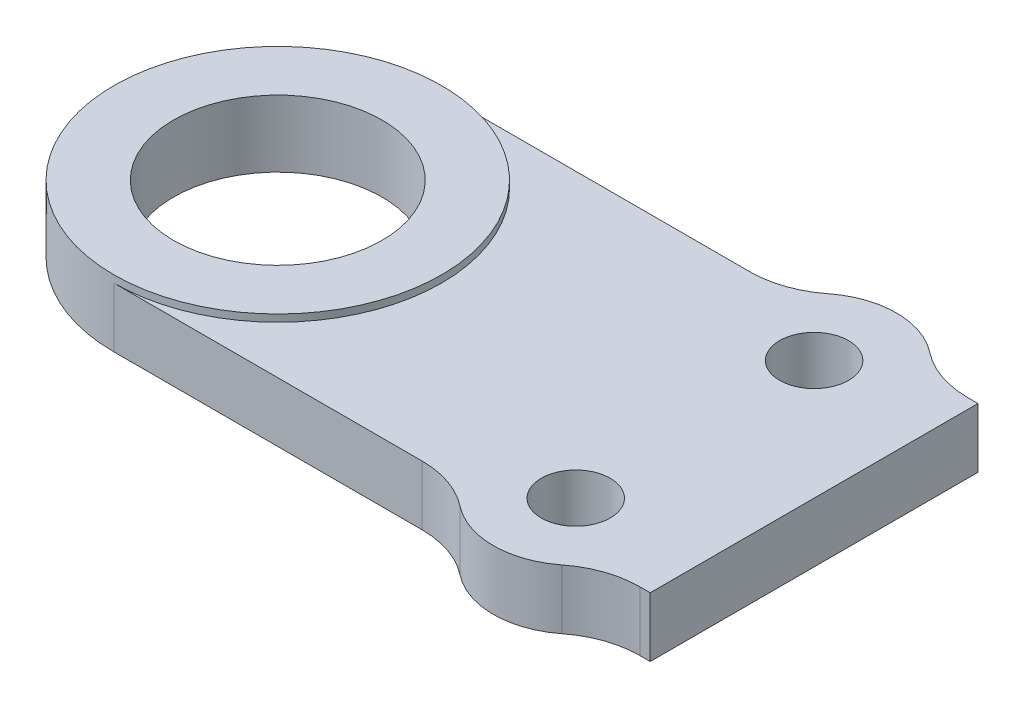
ISO-10303-21;
HEADER;
FILE_DESCRIPTION(('STEP AP214'),'2;1');
FILE_NAME('part.step','',(''),(''),'','','');
FILE_SCHEMA(('AUTOMOTIVE_DESIGN { 1 0 10303 214 1 1 1 1 }'));
ENDSEC;
DATA;
#1=APPLICATION_CONTEXT('core data for automotive mechanical design processes');
#2=APPLICATION_PROTOCOL_DEFINITION('international standard','automotive_design',2000,#1);
#3=PRODUCT_CONTEXT('',#1,'mechanical');
#4=PRODUCT('Part','Part','',(#3));
#5=PRODUCT_RELATED_PRODUCT_CATEGORY('part','',(#4));
#6=PRODUCT_DEFINITION_FORMATION('','',#4);
#7=PRODUCT_DEFINITION_CONTEXT('part definition',#1,'design');
#8=PRODUCT_DEFINITION('design','',#6,#7);
#9=PRODUCT_DEFINITION_SHAPE('','',#8);
#10=(LENGTH_UNIT() NAMED_UNIT(*) SI_UNIT(.MILLI.,.METRE.));
#11=(NAMED_UNIT(*) PLANE_ANGLE_UNIT() SI_UNIT($,.RADIAN.));
#12=(NAMED_UNIT(*) SI_UNIT($,.STERADIAN.) SOLID_ANGLE_UNIT());
#13=UNCERTAINTY_MEASURE_WITH_UNIT(LENGTH_MEASURE(1.E-05),#10,'distance_accuracy_value','');
#14=(GEOMETRIC_REPRESENTATION_CONTEXT(3) GLOBAL_UNCERTAINTY_ASSIGNED_CONTEXT((#13)) GLOBAL_UNIT_ASSIGNED_CONTEXT((#10,
#11,#12)) REPRESENTATION_CONTEXT('',''));
#15=CARTESIAN_POINT('',(0.,0.,0.));
#16=DIRECTION('',(0.,0.,1.));
#17=DIRECTION('',(1.,0.,0.));
#18=AXIS2_PLACEMENT_3D('',#15,#16,#17);
#19=CARTESIAN_POINT('',(0.151037449392715,6.35,-19.1962171052632));
#20=DIRECTION('',(0.,-1.,0.));
#21=DIRECTION('',(0.,0.,-1.));
#22=AXIS2_PLACEMENT_3D('',#19,#20,#21);
#23=PLANE('',#22);
#24=CARTESIAN_POINT('',(0.151037449392716,6.35,-19.1962171052632));
#25=DIRECTION('',(0.,1.,0.));
#26=DIRECTION('',(0.,0.,1.));
#27=AXIS2_PLACEMENT_3D('',#24,#25,#26);
#28=CIRCLE('',#27,3.675);
#29=CARTESIAN_POINT('',(0.151037449392716,6.35,-15.5212171052632));
#30=VERTEX_POINT('',#29);
#31=EDGE_CURVE('E345',#30,#30,#28,.T.);
#32=ORIENTED_EDGE('',*,*,#31,.F.);
#33=EDGE_LOOP('',(#32));
#34=FACE_BOUND('',#33,.T.);
#35=CARTESIAN_POINT('',(0.151037449392719,6.35,6.20378289473684));
#36=DIRECTION('',(0.,1.,0.));
#37=DIRECTION('',(0.,0.,1.));
#38=AXIS2_PLACEMENT_3D('',#35,#36,#37);
#39=CIRCLE('',#38,3.675);
#40=CARTESIAN_POINT('',(0.151037449392719,6.35,9.87878289473684));
#41=VERTEX_POINT('',#40);
#42=EDGE_CURVE('E152',#41,#41,#39,.T.);
#43=ORIENTED_EDGE('',*,*,#42,.F.);
#44=EDGE_LOOP('',(#43));
#45=FACE_BOUND('',#44,.T.);
#46=CARTESIAN_POINT('',(-44.2989625506073,6.35,-6.49621710526316));
#47=DIRECTION('',(0.,1.,0.));
#48=DIRECTION('',(0.,0.,1.));
#49=AXIS2_PLACEMENT_3D('',#46,#47,#48);
#50=CIRCLE('',#49,17.4625);
#51=CARTESIAN_POINT('',(-44.2989625506073,6.35,10.9662828947368));
#52=VERTEX_POINT('',#51);
#53=CARTESIAN_POINT('',(-44.2989625506073,6.35,-23.9587171052632));
#54=VERTEX_POINT('',#53);
#55=EDGE_CURVE('E141',#52,#54,#50,.T.);
#56=ORIENTED_EDGE('',*,*,#55,.F.);
#57=DIRECTION('',(1.,0.,0.));
#58=VECTOR('',#57,1.);
#59=CARTESIAN_POINT('',(-7.22409275692232,6.35,10.9662828947368));
#60=LINE('',#59,#58);
#61=CARTESIAN_POINT('',(-11.4561193511259,6.35,10.9662828947368));
#62=VERTEX_POINT('',#61);
#63=EDGE_CURVE('E123',#52,#62,#60,.T.);
#64=ORIENTED_EDGE('',*,*,#63,.T.);
#65=CARTESIAN_POINT('',(-11.4561193511259,6.35,20.9662828947368));
#66=DIRECTION('',(0.,-1.,0.));
#67=DIRECTION('',(0.,0.,-1.));
#68=AXIS2_PLACEMENT_3D('',#65,#66,#67);
#69=CIRCLE('',#68,10.);
#70=CARTESIAN_POINT('',(-5.27525386673139,6.35,13.1051823443164));
#71=VERTEX_POINT('',#70);
#72=EDGE_CURVE('E213',#62,#71,#69,.T.);
#73=ORIENTED_EDGE('',*,*,#72,.T.);
#74=CARTESIAN_POINT('',(0.151037449392715,6.35,6.20378289473683));
#75=DIRECTION('',(0.,1.,0.));
#76=DIRECTION('',(0.,0.,1.));
#77=AXIS2_PLACEMENT_3D('',#74,#75,#76);
#78=CIRCLE('',#77,8.77917717158621);
#79=CARTESIAN_POINT('',(5.57732876551683,6.35,13.1051823443164));
#80=VERTEX_POINT('',#79);
#81=EDGE_CURVE('E133',#71,#80,#78,.T.);
#82=ORIENTED_EDGE('',*,*,#81,.T.);
#83=CARTESIAN_POINT('',(11.7581942499113,6.35,20.9662828947368));
#84=DIRECTION('',(0.,-1.,0.));
#85=DIRECTION('',(0.,0.,-1.));
#86=AXIS2_PLACEMENT_3D('',#83,#84,#85);
#87=CIRCLE('',#86,10.);
#88=CARTESIAN_POINT('',(11.7581942499113,6.35,10.9662828947368));
#89=VERTEX_POINT('',#88);
#90=EDGE_CURVE('E11',#80,#89,#87,.T.);
#91=ORIENTED_EDGE('',*,*,#90,.T.);
#92=DIRECTION('',(1.,0.,0.));
#93=VECTOR('',#92,1.);
#94=CARTESIAN_POINT('',(7.52616765570776,6.35,10.9662828947368));
#95=LINE('',#94,#93);
#96=CARTESIAN_POINT('',(12.8510374493927,6.35,10.9662828947368));
#97=VERTEX_POINT('',#96);
#98=EDGE_CURVE('E226',#89,#97,#95,.T.);
#99=ORIENTED_EDGE('',*,*,#98,.T.);
#100=DIRECTION('',(0.,0.,-1.));
#101=VECTOR('',#100,1.);
#102=CARTESIAN_POINT('',(12.8510374493927,6.35,-23.9587171052632));
#103=LINE('',#102,#101);
#104=CARTESIAN_POINT('',(12.8510374493927,6.35,-23.9587171052632));
#105=VERTEX_POINT('',#104);
#106=EDGE_CURVE('E232',#97,#105,#103,.T.);
#107=ORIENTED_EDGE('',*,*,#106,.T.);
#108=DIRECTION('',(-1.,0.,0.));
#109=VECTOR('',#108,1.);
#110=CARTESIAN_POINT('',(7.52616765570776,6.35,-23.9587171052632));
#111=LINE('',#110,#109);
#112=CARTESIAN_POINT('',(11.7581942499113,6.35,-23.9587171052632));
#113=VERTEX_POINT('',#112);
#114=EDGE_CURVE('E234',#105,#113,#111,.T.);
#115=ORIENTED_EDGE('',*,*,#114,.T.);
#116=CARTESIAN_POINT('',(11.7581942499113,6.35,-33.9587171052632));
#117=DIRECTION('',(0.,-1.,0.));
#118=DIRECTION('',(0.,0.,-1.));
#119=AXIS2_PLACEMENT_3D('',#116,#117,#118);
#120=CIRCLE('',#119,10.);
#121=CARTESIAN_POINT('',(5.57732876551683,6.35,-26.0976165548427));
#122=VERTEX_POINT('',#121);
#123=EDGE_CURVE('E205',#113,#122,#120,.T.);
#124=ORIENTED_EDGE('',*,*,#123,.T.);
#125=CARTESIAN_POINT('',(0.151037449392715,6.35,-19.1962171052632));
#126=DIRECTION('',(0.,1.,0.));
#127=DIRECTION('',(0.,0.,-1.));
#128=AXIS2_PLACEMENT_3D('',#125,#126,#127);
#129=CIRCLE('',#128,8.77917717158622);
#130=CARTESIAN_POINT('',(-5.2752538667314,6.35,-26.0976165548427));
#131=VERTEX_POINT('',#130);
#132=EDGE_CURVE('E168',#122,#131,#129,.T.);
#133=ORIENTED_EDGE('',*,*,#132,.T.);
#134=CARTESIAN_POINT('',(-11.4561193511259,6.35,-33.9587171052632));
#135=DIRECTION('',(0.,-1.,0.));
#136=DIRECTION('',(0.,0.,-1.));
#137=AXIS2_PLACEMENT_3D('',#134,#135,#136);
#138=CIRCLE('',#137,10.);
#139=CARTESIAN_POINT('',(-11.4561193511259,6.35,-23.9587171052632));
#140=VERTEX_POINT('',#139);
#141=EDGE_CURVE('E209',#131,#140,#138,.T.);
#142=ORIENTED_EDGE('',*,*,#141,.T.);
#143=DIRECTION('',(-1.,0.,0.));
#144=VECTOR('',#143,1.);
#145=CARTESIAN_POINT('',(-44.2989625506073,6.35,-23.9587171052632));
#146=LINE('',#145,#144);
#147=EDGE_CURVE('E134',#140,#54,#146,.T.);
#148=ORIENTED_EDGE('',*,*,#147,.T.);
#149=EDGE_LOOP('',(#56,#64,#73,#82,#91,#99,#107,#115,#124,#133,#142,#148));
#150=FACE_BOUND('',#149,.T.);
#151=ADVANCED_FACE('F33',(#34,#45,#150),#23,.F.);
#152=CARTESIAN_POINT('',(0.151037449392715,0.,-19.1962171052632));
#153=DIRECTION('',(0.,-1.,0.));
#154=DIRECTION('',(0.,0.,-1.));
#155=AXIS2_PLACEMENT_3D('',#152,#153,#154);
#156=PLANE('',#155);
#157=CARTESIAN_POINT('',(0.151037449392719,0.,6.20378289473684));
#158=DIRECTION('',(0.,1.,0.));
#159=DIRECTION('',(0.,0.,1.));
#160=AXIS2_PLACEMENT_3D('',#157,#158,#159);
#161=CIRCLE('',#160,3.675);
#162=CARTESIAN_POINT('',(0.151037449392719,0.,9.87878289473684));
#163=VERTEX_POINT('',#162);
#164=EDGE_CURVE('E158',#163,#163,#161,.T.);
#165=ORIENTED_EDGE('',*,*,#164,.T.);
#166=EDGE_LOOP('',(#165));
#167=FACE_BOUND('',#166,.T.);
#168=CARTESIAN_POINT('',(0.151037449392716,0.,-19.1962171052632));
#169=DIRECTION('',(0.,1.,0.));
#170=DIRECTION('',(0.,0.,1.));
#171=AXIS2_PLACEMENT_3D('',#168,#169,#170);
#172=CIRCLE('',#171,3.675);
#173=CARTESIAN_POINT('',(0.151037449392716,0.,-15.5212171052632));
#174=VERTEX_POINT('',#173);
#175=EDGE_CURVE('E343',#174,#174,#172,.T.);
#176=ORIENTED_EDGE('',*,*,#175,.T.);
#177=EDGE_LOOP('',(#176));
#178=FACE_BOUND('',#177,.T.);
#179=DIRECTION('',(1.,0.,0.));
#180=VECTOR('',#179,1.);
#181=CARTESIAN_POINT('',(7.52616765570776,0.,10.9662828947368));
#182=LINE('',#181,#180);
#183=CARTESIAN_POINT('',(11.7581942499113,0.,10.9662828947368));
#184=VERTEX_POINT('',#183);
#185=CARTESIAN_POINT('',(12.8510374493927,0.,10.9662828947368));
#186=VERTEX_POINT('',#185);
#187=EDGE_CURVE('E221',#184,#186,#182,.T.);
#188=ORIENTED_EDGE('',*,*,#187,.F.);
#189=CARTESIAN_POINT('',(11.7581942499113,0.,20.9662828947368));
#190=DIRECTION('',(0.,-1.,0.));
#191=DIRECTION('',(0.,0.,-1.));
#192=AXIS2_PLACEMENT_3D('',#189,#190,#191);
#193=CIRCLE('',#192,10.);
#194=CARTESIAN_POINT('',(5.57732876551683,0.,13.1051823443164));
#195=VERTEX_POINT('',#194);
#196=EDGE_CURVE('E42',#184,#195,#193,.F.);
#197=ORIENTED_EDGE('',*,*,#196,.T.);
#198=CARTESIAN_POINT('',(0.151037449392715,0.,6.20378289473683));
#199=DIRECTION('',(0.,1.,0.));
#200=DIRECTION('',(0.,0.,1.));
#201=AXIS2_PLACEMENT_3D('',#198,#199,#200);
#202=CIRCLE('',#201,8.77917717158621);
#203=CARTESIAN_POINT('',(-5.27525386673139,0.,13.1051823443164));
#204=VERTEX_POINT('',#203);
#205=EDGE_CURVE('E183',#204,#195,#202,.T.);
#206=ORIENTED_EDGE('',*,*,#205,.F.);
#207=CARTESIAN_POINT('',(-11.4561193511259,0.,20.9662828947368));
#208=DIRECTION('',(0.,-1.,0.));
#209=DIRECTION('',(0.,0.,-1.));
#210=AXIS2_PLACEMENT_3D('',#207,#208,#209);
#211=CIRCLE('',#210,10.);
#212=CARTESIAN_POINT('',(-11.4561193511259,0.,10.9662828947368));
#213=VERTEX_POINT('',#212);
#214=EDGE_CURVE('E211',#204,#213,#211,.F.);
#215=ORIENTED_EDGE('',*,*,#214,.T.);
#216=DIRECTION('',(1.,0.,0.));
#217=VECTOR('',#216,1.);
#218=CARTESIAN_POINT('',(-7.22409275692232,0.,10.9662828947368));
#219=LINE('',#218,#217);
#220=CARTESIAN_POINT('',(-44.2989625506073,0.,10.9662828947368));
#221=VERTEX_POINT('',#220);
#222=EDGE_CURVE('E227',#221,#213,#219,.T.);
#223=ORIENTED_EDGE('',*,*,#222,.F.);
#224=CARTESIAN_POINT('',(-44.2989625506073,0.,-6.49621710526316));
#225=DIRECTION('',(0.,1.,0.));
#226=DIRECTION('',(0.,0.,1.));
#227=AXIS2_PLACEMENT_3D('',#224,#225,#226);
#228=CIRCLE('',#227,17.4625);
#229=CARTESIAN_POINT('',(-44.2989625506073,0.,-23.9587171052632));
#230=VERTEX_POINT('',#229);
#231=EDGE_CURVE('E143',#230,#221,#228,.T.);
#232=ORIENTED_EDGE('',*,*,#231,.F.);
#233=DIRECTION('',(-1.,0.,0.));
#234=VECTOR('',#233,1.);
#235=CARTESIAN_POINT('',(-44.2989625506073,0.,-23.9587171052632));
#236=LINE('',#235,#234);
#237=CARTESIAN_POINT('',(-11.4561193511259,0.,-23.9587171052632));
#238=VERTEX_POINT('',#237);
#239=EDGE_CURVE('E253',#238,#230,#236,.T.);
#240=ORIENTED_EDGE('',*,*,#239,.F.);
#241=CARTESIAN_POINT('',(-11.4561193511259,0.,-33.9587171052632));
#242=DIRECTION('',(0.,-1.,0.));
#243=DIRECTION('',(0.,0.,-1.));
#244=AXIS2_PLACEMENT_3D('',#241,#242,#243);
#245=CIRCLE('',#244,10.);
#246=CARTESIAN_POINT('',(-5.2752538667314,0.,-26.0976165548427));
#247=VERTEX_POINT('',#246);
#248=EDGE_CURVE('E207',#238,#247,#245,.F.);
#249=ORIENTED_EDGE('',*,*,#248,.T.);
#250=CARTESIAN_POINT('',(0.151037449392715,0.,-19.1962171052632));
#251=DIRECTION('',(0.,1.,0.));
#252=DIRECTION('',(0.,0.,-1.));
#253=AXIS2_PLACEMENT_3D('',#250,#251,#252);
#254=CIRCLE('',#253,8.77917717158622);
#255=CARTESIAN_POINT('',(5.57732876551683,0.,-26.0976165548427));
#256=VERTEX_POINT('',#255);
#257=EDGE_CURVE('E250',#256,#247,#254,.T.);
#258=ORIENTED_EDGE('',*,*,#257,.F.);
#259=CARTESIAN_POINT('',(11.7581942499113,0.,-33.9587171052632));
#260=DIRECTION('',(0.,-1.,0.));
#261=DIRECTION('',(0.,0.,-1.));
#262=AXIS2_PLACEMENT_3D('',#259,#260,#261);
#263=CIRCLE('',#262,10.);
#264=CARTESIAN_POINT('',(11.7581942499113,0.,-23.9587171052632));
#265=VERTEX_POINT('',#264);
#266=EDGE_CURVE('E203',#256,#265,#263,.F.);
#267=ORIENTED_EDGE('',*,*,#266,.T.);
#268=DIRECTION('',(-1.,0.,0.));
#269=VECTOR('',#268,1.);
#270=CARTESIAN_POINT('',(7.52616765570776,0.,-23.9587171052632));
#271=LINE('',#270,#269);
#272=CARTESIAN_POINT('',(12.8510374493927,0.,-23.9587171052632));
#273=VERTEX_POINT('',#272);
#274=EDGE_CURVE('E248',#273,#265,#271,.T.);
#275=ORIENTED_EDGE('',*,*,#274,.F.);
#276=DIRECTION('',(0.,0.,-1.));
#277=VECTOR('',#276,1.);
#278=CARTESIAN_POINT('',(12.8510374493927,0.,-23.9587171052632));
#279=LINE('',#278,#277);
#280=EDGE_CURVE('E246',#186,#273,#279,.T.);
#281=ORIENTED_EDGE('',*,*,#280,.F.);
#282=EDGE_LOOP('',(#188,#197,#206,#215,#223,#232,#240,#249,#258,#267,#275,#281));
#283=FACE_BOUND('',#282,.T.);
#284=CARTESIAN_POINT('',(-44.2989625506073,0.,-6.49621710526316));
#285=DIRECTION('',(0.,1.,0.));
#286=DIRECTION('',(0.,0.,1.));
#287=AXIS2_PLACEMENT_3D('',#284,#285,#286);
#288=CIRCLE('',#287,11.1125);
#289=CARTESIAN_POINT('',(-44.2989625506073,0.,4.61628289473683));
#290=VERTEX_POINT('',#289);
#291=EDGE_CURVE('E237',#290,#290,#288,.T.);
#292=ORIENTED_EDGE('',*,*,#291,.T.);
#293=EDGE_LOOP('',(#292));
#294=FACE_BOUND('',#293,.T.);
#295=ADVANCED_FACE('F218',(#167,#178,#283,#294),#156,.T.);
#296=CARTESIAN_POINT('',(7.52616765570776,6.35,10.9662828947368));
#297=DIRECTION('',(0.,0.,-1.));
#298=DIRECTION('',(-1.,0.,0.));
#299=AXIS2_PLACEMENT_3D('',#296,#297,#298);
#300=PLANE('',#299);
#301=ORIENTED_EDGE('',*,*,#98,.F.);
#302=DIRECTION('',(0.,1.,0.));
#303=VECTOR('',#302,1.);
#304=CARTESIAN_POINT('',(11.7581942499113,0.,10.9662828947368));
#305=LINE('',#304,#303);
#306=EDGE_CURVE('E201',#89,#184,#305,.F.);
#307=ORIENTED_EDGE('',*,*,#306,.T.);
#308=ORIENTED_EDGE('',*,*,#187,.T.);
#309=DIRECTION('',(0.,-1.,0.));
#310=VECTOR('',#309,1.);
#311=CARTESIAN_POINT('',(12.8510374493927,6.35,10.9662828947368));
#312=LINE('',#311,#310);
#313=EDGE_CURVE('E172',#97,#186,#312,.T.);
#314=ORIENTED_EDGE('',*,*,#313,.F.);
#315=EDGE_LOOP('',(#301,#307,#308,#314));
#316=FACE_BOUND('',#315,.T.);
#317=ADVANCED_FACE('F229',(#316),#300,.F.);
#318=CARTESIAN_POINT('',(12.8510374493927,6.35,-23.9587171052632));
#319=DIRECTION('',(-1.,0.,0.));
#320=DIRECTION('',(0.,0.,1.));
#321=AXIS2_PLACEMENT_3D('',#318,#319,#320);
#322=PLANE('',#321);
#323=ORIENTED_EDGE('',*,*,#280,.T.);
#324=DIRECTION('',(0.,-1.,0.));
#325=VECTOR('',#324,1.);
#326=CARTESIAN_POINT('',(12.8510374493927,6.35,-23.9587171052632));
#327=LINE('',#326,#325);
#328=EDGE_CURVE('E170',#105,#273,#327,.T.);
#329=ORIENTED_EDGE('',*,*,#328,.F.);
#330=ORIENTED_EDGE('',*,*,#106,.F.);
#331=ORIENTED_EDGE('',*,*,#313,.T.);
#332=EDGE_LOOP('',(#323,#329,#330,#331));
#333=FACE_BOUND('',#332,.T.);
#334=ADVANCED_FACE('F298',(#333),#322,.F.);
#335=CARTESIAN_POINT('',(7.52616765570776,6.35,-23.9587171052632));
#336=DIRECTION('',(0.,0.,1.));
#337=DIRECTION('',(1.,0.,0.));
#338=AXIS2_PLACEMENT_3D('',#335,#336,#337);
#339=PLANE('',#338);
#340=ORIENTED_EDGE('',*,*,#274,.T.);
#341=DIRECTION('',(0.,1.,0.));
#342=VECTOR('',#341,1.);
#343=CARTESIAN_POINT('',(11.7581942499113,6.35,-23.9587171052632));
#344=LINE('',#343,#342);
#345=EDGE_CURVE('E190',#265,#113,#344,.T.);
#346=ORIENTED_EDGE('',*,*,#345,.T.);
#347=ORIENTED_EDGE('',*,*,#114,.F.);
#348=ORIENTED_EDGE('',*,*,#328,.T.);
#349=EDGE_LOOP('',(#340,#346,#347,#348));
#350=FACE_BOUND('',#349,.T.);
#351=ADVANCED_FACE('F294',(#350),#339,.F.);
#352=CARTESIAN_POINT('',(0.151037449392715,6.35,-19.1962171052632));
#353=DIRECTION('',(0.,-1.,0.));
#354=DIRECTION('',(0.,0.,-1.));
#355=AXIS2_PLACEMENT_3D('',#352,#353,#354);
#356=CYLINDRICAL_SURFACE('',#355,8.77917717158622);
#357=ORIENTED_EDGE('',*,*,#132,.F.);
#358=DIRECTION('',(0.,-1.,0.));
#359=VECTOR('',#358,1.);
#360=CARTESIAN_POINT('',(5.57732876551683,6.35,-26.0976165548427));
#361=LINE('',#360,#359);
#362=EDGE_CURVE('E187',#122,#256,#361,.T.);
#363=ORIENTED_EDGE('',*,*,#362,.T.);
#364=ORIENTED_EDGE('',*,*,#257,.T.);
#365=DIRECTION('',(0.,-1.,0.));
#366=VECTOR('',#365,1.);
#367=CARTESIAN_POINT('',(-5.2752538667314,6.35,-26.0976165548427));
#368=LINE('',#367,#366);
#369=EDGE_CURVE('E180',#247,#131,#368,.F.);
#370=ORIENTED_EDGE('',*,*,#369,.T.);
#371=EDGE_LOOP('',(#357,#363,#364,#370));
#372=FACE_BOUND('',#371,.T.);
#373=ADVANCED_FACE('F290',(#372),#356,.T.);
#374=CARTESIAN_POINT('',(-44.2989625506073,6.35,-23.9587171052632));
#375=DIRECTION('',(0.,0.,1.));
#376=DIRECTION('',(1.,0.,0.));
#377=AXIS2_PLACEMENT_3D('',#374,#375,#376);
#378=PLANE('',#377);
#379=ORIENTED_EDGE('',*,*,#147,.F.);
#380=DIRECTION('',(0.,1.,0.));
#381=VECTOR('',#380,1.);
#382=CARTESIAN_POINT('',(-11.4561193511259,0.,-23.9587171052632));
#383=LINE('',#382,#381);
#384=EDGE_CURVE('E192',#140,#238,#383,.F.);
#385=ORIENTED_EDGE('',*,*,#384,.T.);
#386=ORIENTED_EDGE('',*,*,#239,.T.);
#387=DIRECTION('',(0.,-1.,0.));
#388=VECTOR('',#387,1.);
#389=CARTESIAN_POINT('',(-44.2989625506073,6.35,-23.9587171052632));
#390=LINE('',#389,#388);
#391=EDGE_CURVE('E144',#54,#230,#390,.T.);
#392=ORIENTED_EDGE('',*,*,#391,.F.);
#393=EDGE_LOOP('',(#379,#385,#386,#392));
#394=FACE_BOUND('',#393,.T.);
#395=ADVANCED_FACE('F287',(#394),#378,.F.);
#396=CARTESIAN_POINT('',(-44.2989625506073,6.35,-6.49621710526316));
#397=DIRECTION('',(0.,-1.,0.));
#398=DIRECTION('',(0.,0.,-1.));
#399=AXIS2_PLACEMENT_3D('',#396,#397,#398);
#400=CYLINDRICAL_SURFACE('',#399,17.4625);
#401=ORIENTED_EDGE('',*,*,#231,.T.);
#402=DIRECTION('',(0.,-1.,0.));
#403=VECTOR('',#402,1.);
#404=CARTESIAN_POINT('',(-44.2989625506073,6.35,10.9662828947368));
#405=LINE('',#404,#403);
#406=EDGE_CURVE('E127',#52,#221,#405,.T.);
#407=ORIENTED_EDGE('',*,*,#406,.F.);
#408=ORIENTED_EDGE('',*,*,#55,.T.);
#409=ORIENTED_EDGE('',*,*,#391,.T.);
#410=EDGE_LOOP('',(#401,#407,#408,#409));
#411=FACE_BOUND('',#410,.T.);
#412=CARTESIAN_POINT('',(-44.2989625506073,7.112,-6.49621710526316));
#413=DIRECTION('',(0.,1.,0.));
#414=DIRECTION('',(0.,0.,1.));
#415=AXIS2_PLACEMENT_3D('',#412,#413,#414);
#416=CIRCLE('',#415,17.4625);
#417=CARTESIAN_POINT('',(-44.2989625506073,7.112,10.9662828947368));
#418=VERTEX_POINT('',#417);
#419=EDGE_CURVE('E148',#418,#418,#416,.T.);
#420=ORIENTED_EDGE('',*,*,#419,.F.);
#421=EDGE_LOOP('',(#420));
#422=FACE_BOUND('',#421,.T.);
#423=ADVANCED_FACE('F138',(#411,#422),#400,.T.);
#424=CARTESIAN_POINT('',(-7.22409275692232,6.35,10.9662828947368));
#425=DIRECTION('',(0.,0.,-1.));
#426=DIRECTION('',(-1.,0.,0.));
#427=AXIS2_PLACEMENT_3D('',#424,#425,#426);
#428=PLANE('',#427);
#429=ORIENTED_EDGE('',*,*,#222,.T.);
#430=DIRECTION('',(0.,1.,0.));
#431=VECTOR('',#430,1.);
#432=CARTESIAN_POINT('',(-11.4561193511259,6.35,10.9662828947368));
#433=LINE('',#432,#431);
#434=EDGE_CURVE('E130',#213,#62,#433,.T.);
#435=ORIENTED_EDGE('',*,*,#434,.T.);
#436=ORIENTED_EDGE('',*,*,#63,.F.);
#437=ORIENTED_EDGE('',*,*,#406,.T.);
#438=EDGE_LOOP('',(#429,#435,#436,#437));
#439=FACE_BOUND('',#438,.T.);
#440=ADVANCED_FACE('F126',(#439),#428,.F.);
#441=CARTESIAN_POINT('',(0.151037449392715,6.35,6.20378289473683));
#442=DIRECTION('',(0.,-1.,0.));
#443=DIRECTION('',(0.,0.,-1.));
#444=AXIS2_PLACEMENT_3D('',#441,#442,#443);
#445=CYLINDRICAL_SURFACE('',#444,8.77917717158621);
#446=ORIENTED_EDGE('',*,*,#81,.F.);
#447=DIRECTION('',(0.,-1.,0.));
#448=VECTOR('',#447,1.);
#449=CARTESIAN_POINT('',(-5.27525386673139,6.35,13.1051823443164));
#450=LINE('',#449,#448);
#451=EDGE_CURVE('E197',#71,#204,#450,.T.);
#452=ORIENTED_EDGE('',*,*,#451,.T.);
#453=ORIENTED_EDGE('',*,*,#205,.T.);
#454=DIRECTION('',(0.,-1.,0.));
#455=VECTOR('',#454,1.);
#456=CARTESIAN_POINT('',(5.57732876551683,6.35,13.1051823443164));
#457=LINE('',#456,#455);
#458=EDGE_CURVE('E195',#195,#80,#457,.F.);
#459=ORIENTED_EDGE('',*,*,#458,.T.);
#460=EDGE_LOOP('',(#446,#452,#453,#459));
#461=FACE_BOUND('',#460,.T.);
#462=ADVANCED_FACE('F224',(#461),#445,.T.);
#463=CARTESIAN_POINT('',(-44.2989625506073,6.35,-6.49621710526316));
#464=DIRECTION('',(0.,-1.,0.));
#465=DIRECTION('',(0.,0.,-1.));
#466=AXIS2_PLACEMENT_3D('',#463,#464,#465);
#467=CYLINDRICAL_SURFACE('',#466,11.1125);
#468=ORIENTED_EDGE('',*,*,#291,.F.);
#469=EDGE_LOOP('',(#468));
#470=FACE_BOUND('',#469,.T.);
#471=CARTESIAN_POINT('',(-44.2989625506073,7.112,-6.49621710526316));
#472=DIRECTION('',(0.,1.,0.));
#473=DIRECTION('',(0.,0.,1.));
#474=AXIS2_PLACEMENT_3D('',#471,#472,#473);
#475=CIRCLE('',#474,11.1125);
#476=CARTESIAN_POINT('',(-44.2989625506073,7.112,4.61628289473683));
#477=VERTEX_POINT('',#476);
#478=EDGE_CURVE('E149',#477,#477,#475,.T.);
#479=ORIENTED_EDGE('',*,*,#478,.T.);
#480=EDGE_LOOP('',(#479));
#481=FACE_BOUND('',#480,.T.);
#482=ADVANCED_FACE('F278',(#470,#481),#467,.F.);
#483=CARTESIAN_POINT('',(0.151037449392716,0.,-19.1962171052632));
#484=DIRECTION('',(0.,1.,0.));
#485=DIRECTION('',(0.,0.,1.));
#486=AXIS2_PLACEMENT_3D('',#483,#484,#485);
#487=CYLINDRICAL_SURFACE('',#486,3.675);
#488=ORIENTED_EDGE('',*,*,#175,.F.);
#489=EDGE_LOOP('',(#488));
#490=FACE_BOUND('',#489,.T.);
#491=ORIENTED_EDGE('',*,*,#31,.T.);
#492=EDGE_LOOP('',(#491));
#493=FACE_BOUND('',#492,.T.);
#494=ADVANCED_FACE('F310',(#490,#493),#487,.F.);
#495=CARTESIAN_POINT('',(0.151037449392719,0.,6.20378289473684));
#496=DIRECTION('',(0.,1.,0.));
#497=DIRECTION('',(0.,0.,1.));
#498=AXIS2_PLACEMENT_3D('',#495,#496,#497);
#499=CYLINDRICAL_SURFACE('',#498,3.675);
#500=ORIENTED_EDGE('',*,*,#164,.F.);
#501=EDGE_LOOP('',(#500));
#502=FACE_BOUND('',#501,.T.);
#503=ORIENTED_EDGE('',*,*,#42,.T.);
#504=EDGE_LOOP('',(#503));
#505=FACE_BOUND('',#504,.T.);
#506=ADVANCED_FACE('F305',(#502,#505),#499,.F.);
#507=CARTESIAN_POINT('',(11.7581942499113,6.35,-33.9587171052632));
#508=DIRECTION('',(0.,-1.,0.));
#509=DIRECTION('',(0.,0.,-1.));
#510=AXIS2_PLACEMENT_3D('',#507,#508,#509);
#511=CYLINDRICAL_SURFACE('',#510,10.);
#512=ORIENTED_EDGE('',*,*,#123,.F.);
#513=ORIENTED_EDGE('',*,*,#345,.F.);
#514=ORIENTED_EDGE('',*,*,#266,.F.);
#515=ORIENTED_EDGE('',*,*,#362,.F.);
#516=EDGE_LOOP('',(#512,#513,#514,#515));
#517=FACE_BOUND('',#516,.T.);
#518=ADVANCED_FACE('F264',(#517),#511,.F.);
#519=CARTESIAN_POINT('',(-11.4561193511259,6.35,-33.9587171052632));
#520=DIRECTION('',(0.,-1.,0.));
#521=DIRECTION('',(0.,0.,-1.));
#522=AXIS2_PLACEMENT_3D('',#519,#520,#521);
#523=CYLINDRICAL_SURFACE('',#522,10.);
#524=ORIENTED_EDGE('',*,*,#141,.F.);
#525=ORIENTED_EDGE('',*,*,#369,.F.);
#526=ORIENTED_EDGE('',*,*,#248,.F.);
#527=ORIENTED_EDGE('',*,*,#384,.F.);
#528=EDGE_LOOP('',(#524,#525,#526,#527));
#529=FACE_BOUND('',#528,.T.);
#530=ADVANCED_FACE('F258',(#529),#523,.F.);
#531=CARTESIAN_POINT('',(-11.4561193511259,6.35,20.9662828947368));
#532=DIRECTION('',(0.,-1.,0.));
#533=DIRECTION('',(0.,0.,-1.));
#534=AXIS2_PLACEMENT_3D('',#531,#532,#533);
#535=CYLINDRICAL_SURFACE('',#534,10.);
#536=ORIENTED_EDGE('',*,*,#72,.F.);
#537=ORIENTED_EDGE('',*,*,#434,.F.);
#538=ORIENTED_EDGE('',*,*,#214,.F.);
#539=ORIENTED_EDGE('',*,*,#451,.F.);
#540=EDGE_LOOP('',(#536,#537,#538,#539));
#541=FACE_BOUND('',#540,.T.);
#542=ADVANCED_FACE('F256',(#541),#535,.F.);
#543=CARTESIAN_POINT('',(11.7581942499113,6.35,20.9662828947368));
#544=DIRECTION('',(0.,-1.,0.));
#545=DIRECTION('',(0.,0.,-1.));
#546=AXIS2_PLACEMENT_3D('',#543,#544,#545);
#547=CYLINDRICAL_SURFACE('',#546,10.);
#548=ORIENTED_EDGE('',*,*,#90,.F.);
#549=ORIENTED_EDGE('',*,*,#458,.F.);
#550=ORIENTED_EDGE('',*,*,#196,.F.);
#551=ORIENTED_EDGE('',*,*,#306,.F.);
#552=EDGE_LOOP('',(#548,#549,#550,#551));
#553=FACE_BOUND('',#552,.T.);
#554=ADVANCED_FACE('F35',(#553),#547,.F.);
#555=CARTESIAN_POINT('',(-44.2989625506073,7.112,-6.49621710526316));
#556=DIRECTION('',(0.,1.,0.));
#557=DIRECTION('',(0.,0.,1.));
#558=AXIS2_PLACEMENT_3D('',#555,#556,#557);
#559=PLANE('',#558);
#560=ORIENTED_EDGE('',*,*,#478,.F.);
#561=EDGE_LOOP('',(#560));
#562=FACE_BOUND('',#561,.T.);
#563=ORIENTED_EDGE('',*,*,#419,.T.);
#564=EDGE_LOOP('',(#563));
#565=FACE_BOUND('',#564,.T.);
#566=ADVANCED_FACE('F263',(#562,#565),#559,.T.);
#567=CLOSED_SHELL('',(#151,#295,#317,#334,#351,#373,#395,#423,#440,#462,#482,#494,#506,#518,
#530,#542,#554,#566));
#568=MANIFOLD_SOLID_BREP('B2',#567);
#569=ADVANCED_BREP_SHAPE_REPRESENTATION('',(#18,#568),#14);
#570=SHAPE_DEFINITION_REPRESENTATION(#9,#569);
ENDSEC;
END-ISO-10303-21;
